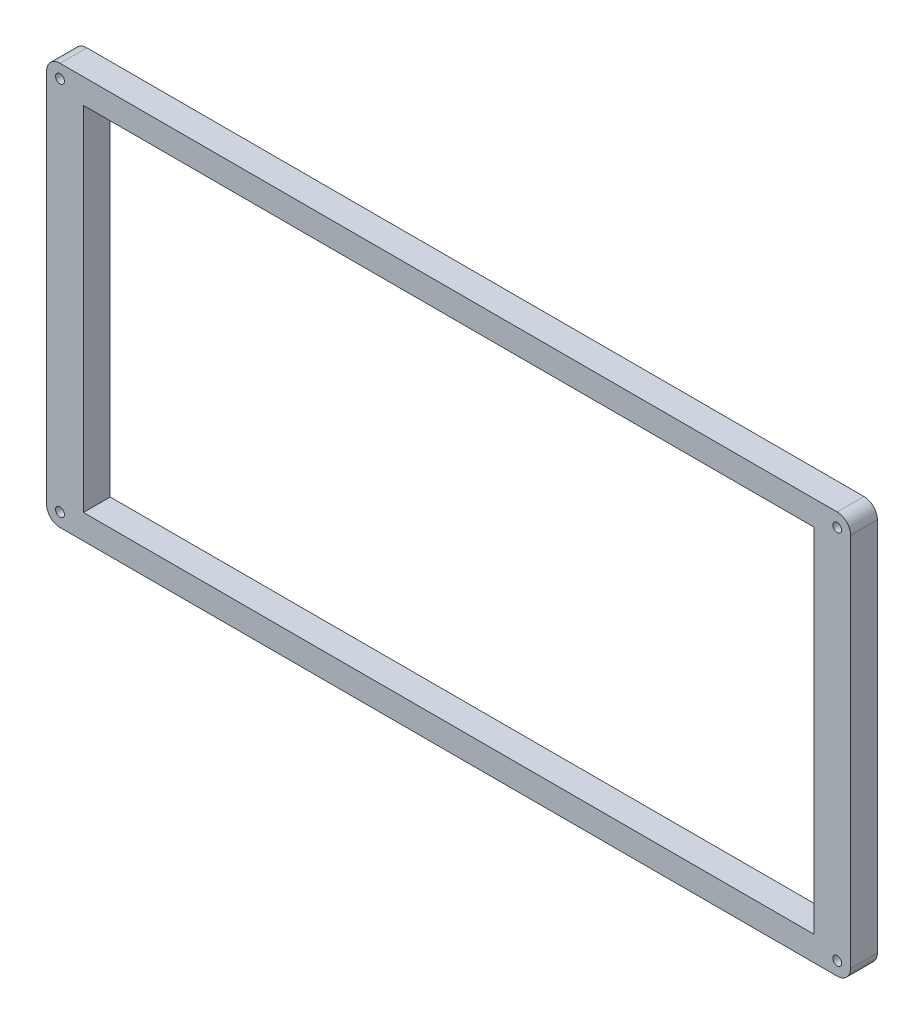
ISO-10303-21;
HEADER;
FILE_DESCRIPTION(('STEP AP214'),'2;1');
FILE_NAME('part.step','',(''),(''),'','','');
FILE_SCHEMA(('AUTOMOTIVE_DESIGN { 1 0 10303 214 1 1 1 1 }'));
ENDSEC;
DATA;
#1=APPLICATION_CONTEXT('core data for automotive mechanical design processes');
#2=APPLICATION_PROTOCOL_DEFINITION('international standard','automotive_design',2000,#1);
#3=PRODUCT_CONTEXT('',#1,'mechanical');
#4=PRODUCT('Part','Part','',(#3));
#5=PRODUCT_RELATED_PRODUCT_CATEGORY('part','',(#4));
#6=PRODUCT_DEFINITION_FORMATION('','',#4);
#7=PRODUCT_DEFINITION_CONTEXT('part definition',#1,'design');
#8=PRODUCT_DEFINITION('design','',#6,#7);
#9=PRODUCT_DEFINITION_SHAPE('','',#8);
#10=(LENGTH_UNIT() NAMED_UNIT(*) SI_UNIT(.MILLI.,.METRE.));
#11=(NAMED_UNIT(*) PLANE_ANGLE_UNIT() SI_UNIT($,.RADIAN.));
#12=(NAMED_UNIT(*) SI_UNIT($,.STERADIAN.) SOLID_ANGLE_UNIT());
#13=UNCERTAINTY_MEASURE_WITH_UNIT(LENGTH_MEASURE(1.E-05),#10,'distance_accuracy_value','');
#14=(GEOMETRIC_REPRESENTATION_CONTEXT(3) GLOBAL_UNCERTAINTY_ASSIGNED_CONTEXT((#13)) GLOBAL_UNIT_ASSIGNED_CONTEXT((#10,
#11,#12)) REPRESENTATION_CONTEXT('',''));
#15=CARTESIAN_POINT('',(0.,0.,0.));
#16=DIRECTION('',(0.,0.,1.));
#17=DIRECTION('',(1.,0.,0.));
#18=AXIS2_PLACEMENT_3D('',#15,#16,#17);
#19=CARTESIAN_POINT('',(212.844809866393,104.874140248241,10.));
#20=DIRECTION('',(0.,0.,-1.));
#21=DIRECTION('',(-1.,0.,0.));
#22=AXIS2_PLACEMENT_3D('',#19,#20,#21);
#23=PLANE('',#22);
#24=CARTESIAN_POINT('',(212.844809866393,104.874140248241,10.));
#25=DIRECTION('',(0.,0.,1.));
#26=DIRECTION('',(1.,0.,0.));
#27=AXIS2_PLACEMENT_3D('',#24,#25,#26);
#28=CIRCLE('',#27,1.65000000000002);
#29=CARTESIAN_POINT('',(214.494809866393,104.874140248241,10.));
#30=VERTEX_POINT('',#29);
#31=EDGE_CURVE('E160',#30,#30,#28,.T.);
#32=ORIENTED_EDGE('',*,*,#31,.F.);
#33=EDGE_LOOP('',(#32));
#34=FACE_BOUND('',#33,.T.);
#35=CARTESIAN_POINT('',(212.844809866393,-35.125859751759,10.));
#36=DIRECTION('',(0.,0.,1.));
#37=DIRECTION('',(1.,0.,0.));
#38=AXIS2_PLACEMENT_3D('',#35,#36,#37);
#39=CIRCLE('',#38,1.65000000000002);
#40=CARTESIAN_POINT('',(214.494809866393,-35.125859751759,10.));
#41=VERTEX_POINT('',#40);
#42=EDGE_CURVE('E166',#41,#41,#39,.T.);
#43=ORIENTED_EDGE('',*,*,#42,.F.);
#44=EDGE_LOOP('',(#43));
#45=FACE_BOUND('',#44,.T.);
#46=CARTESIAN_POINT('',(-77.1551901336074,-35.125859751759,10.));
#47=DIRECTION('',(0.,0.,1.));
#48=DIRECTION('',(1.,0.,0.));
#49=AXIS2_PLACEMENT_3D('',#46,#47,#48);
#50=CIRCLE('',#49,1.65);
#51=CARTESIAN_POINT('',(-75.5051901336074,-35.125859751759,10.));
#52=VERTEX_POINT('',#51);
#53=EDGE_CURVE('E172',#52,#52,#50,.T.);
#54=ORIENTED_EDGE('',*,*,#53,.F.);
#55=EDGE_LOOP('',(#54));
#56=FACE_BOUND('',#55,.T.);
#57=CARTESIAN_POINT('',(-77.1551901336074,104.874140248241,10.));
#58=DIRECTION('',(0.,0.,1.));
#59=DIRECTION('',(1.,0.,0.));
#60=AXIS2_PLACEMENT_3D('',#57,#58,#59);
#61=CIRCLE('',#60,1.65);
#62=CARTESIAN_POINT('',(-75.5051901336074,104.874140248241,10.));
#63=VERTEX_POINT('',#62);
#64=EDGE_CURVE('E178',#63,#63,#61,.T.);
#65=ORIENTED_EDGE('',*,*,#64,.F.);
#66=EDGE_LOOP('',(#65));
#67=FACE_BOUND('',#66,.T.);
#68=CARTESIAN_POINT('',(212.844809866393,104.874140248241,10.));
#69=DIRECTION('',(0.,0.,1.));
#70=DIRECTION('',(-1.,0.,0.));
#71=AXIS2_PLACEMENT_3D('',#68,#69,#70);
#72=CIRCLE('',#71,5.00000000000002);
#73=CARTESIAN_POINT('',(217.844809866393,104.874140248241,10.));
#74=VERTEX_POINT('',#73);
#75=CARTESIAN_POINT('',(212.844809866392,109.874140248241,10.));
#76=VERTEX_POINT('',#75);
#77=EDGE_CURVE('E184',#74,#76,#72,.T.);
#78=ORIENTED_EDGE('',*,*,#77,.T.);
#79=DIRECTION('',(-1.,0.,0.));
#80=VECTOR('',#79,1.);
#81=CARTESIAN_POINT('',(-77.1551901336074,109.874140248241,10.));
#82=LINE('',#81,#80);
#83=CARTESIAN_POINT('',(-77.1551901336074,109.874140248241,10.));
#84=VERTEX_POINT('',#83);
#85=EDGE_CURVE('E187',#76,#84,#82,.T.);
#86=ORIENTED_EDGE('',*,*,#85,.T.);
#87=CARTESIAN_POINT('',(-77.1551901336074,104.874140248241,10.));
#88=DIRECTION('',(0.,0.,1.));
#89=DIRECTION('',(1.,0.,0.));
#90=AXIS2_PLACEMENT_3D('',#87,#88,#89);
#91=CIRCLE('',#90,5.);
#92=CARTESIAN_POINT('',(-82.1551901336074,104.874140248241,10.));
#93=VERTEX_POINT('',#92);
#94=EDGE_CURVE('E190',#84,#93,#91,.T.);
#95=ORIENTED_EDGE('',*,*,#94,.T.);
#96=DIRECTION('',(0.,-1.,0.));
#97=VECTOR('',#96,1.);
#98=CARTESIAN_POINT('',(-82.1551901336074,104.874140248241,10.));
#99=LINE('',#98,#97);
#100=CARTESIAN_POINT('',(-82.1551901336074,-35.125859751759,10.));
#101=VERTEX_POINT('',#100);
#102=EDGE_CURVE('E192',#93,#101,#99,.T.);
#103=ORIENTED_EDGE('',*,*,#102,.T.);
#104=CARTESIAN_POINT('',(-77.1551901336074,-35.125859751759,10.));
#105=DIRECTION('',(0.,0.,1.));
#106=DIRECTION('',(1.,0.,0.));
#107=AXIS2_PLACEMENT_3D('',#104,#105,#106);
#108=CIRCLE('',#107,5.);
#109=CARTESIAN_POINT('',(-77.1551901336074,-40.125859751759,10.));
#110=VERTEX_POINT('',#109);
#111=EDGE_CURVE('E194',#101,#110,#108,.T.);
#112=ORIENTED_EDGE('',*,*,#111,.T.);
#113=DIRECTION('',(1.,0.,0.));
#114=VECTOR('',#113,1.);
#115=CARTESIAN_POINT('',(-77.1551901336074,-40.125859751759,10.));
#116=LINE('',#115,#114);
#117=CARTESIAN_POINT('',(212.844809866393,-40.125859751759,10.));
#118=VERTEX_POINT('',#117);
#119=EDGE_CURVE('E196',#110,#118,#116,.T.);
#120=ORIENTED_EDGE('',*,*,#119,.T.);
#121=CARTESIAN_POINT('',(212.844809866393,-35.125859751759,10.));
#122=DIRECTION('',(0.,0.,1.));
#123=DIRECTION('',(1.,0.,0.));
#124=AXIS2_PLACEMENT_3D('',#121,#122,#123);
#125=CIRCLE('',#124,5.);
#126=CARTESIAN_POINT('',(217.844809866393,-35.125859751759,10.));
#127=VERTEX_POINT('',#126);
#128=EDGE_CURVE('E198',#118,#127,#125,.T.);
#129=ORIENTED_EDGE('',*,*,#128,.T.);
#130=DIRECTION('',(0.,1.,0.));
#131=VECTOR('',#130,1.);
#132=CARTESIAN_POINT('',(217.844809866393,104.874140248241,10.));
#133=LINE('',#132,#131);
#134=EDGE_CURVE('E200',#127,#74,#133,.T.);
#135=ORIENTED_EDGE('',*,*,#134,.T.);
#136=EDGE_LOOP('',(#78,#86,#95,#103,#112,#120,#129,#135));
#137=FACE_BOUND('',#136,.T.);
#138=DIRECTION('',(0.,1.,0.));
#139=VECTOR('',#138,1.);
#140=CARTESIAN_POINT('',(204.106703020252,-30.9074633432772,10.));
#141=LINE('',#140,#139);
#142=CARTESIAN_POINT('',(204.106703020252,-30.9074633432772,10.));
#143=VERTEX_POINT('',#142);
#144=CARTESIAN_POINT('',(204.106703020252,100.655743839759,10.));
#145=VERTEX_POINT('',#144);
#146=EDGE_CURVE('E124',#143,#145,#141,.T.);
#147=ORIENTED_EDGE('',*,*,#146,.F.);
#148=DIRECTION('',(1.,0.,0.));
#149=VECTOR('',#148,1.);
#150=CARTESIAN_POINT('',(-68.4170832874667,-30.9074633432772,10.));
#151=LINE('',#150,#149);
#152=CARTESIAN_POINT('',(-68.4170832874667,-30.9074633432772,10.));
#153=VERTEX_POINT('',#152);
#154=EDGE_CURVE('E146',#153,#143,#151,.T.);
#155=ORIENTED_EDGE('',*,*,#154,.F.);
#156=DIRECTION('',(0.,-1.,0.));
#157=VECTOR('',#156,1.);
#158=CARTESIAN_POINT('',(-68.4170832874667,-30.9074633432772,10.));
#159=LINE('',#158,#157);
#160=CARTESIAN_POINT('',(-68.4170832874667,100.655743839759,10.));
#161=VERTEX_POINT('',#160);
#162=EDGE_CURVE('E144',#161,#153,#159,.T.);
#163=ORIENTED_EDGE('',*,*,#162,.F.);
#164=DIRECTION('',(-1.,0.,0.));
#165=VECTOR('',#164,1.);
#166=CARTESIAN_POINT('',(-68.4170832874667,100.655743839759,10.));
#167=LINE('',#166,#165);
#168=EDGE_CURVE('E132',#145,#161,#167,.T.);
#169=ORIENTED_EDGE('',*,*,#168,.F.);
#170=EDGE_LOOP('',(#147,#155,#163,#169));
#171=FACE_BOUND('',#170,.T.);
#172=ADVANCED_FACE('F35',(#34,#45,#56,#67,#137,#171),#23,.F.);
#173=CARTESIAN_POINT('',(212.844809866393,104.874140248241,0.));
#174=DIRECTION('',(0.,0.,-1.));
#175=DIRECTION('',(-1.,0.,0.));
#176=AXIS2_PLACEMENT_3D('',#173,#174,#175);
#177=PLANE('',#176);
#178=CARTESIAN_POINT('',(212.844809866393,-35.125859751759,0.));
#179=DIRECTION('',(0.,0.,1.));
#180=DIRECTION('',(1.,0.,0.));
#181=AXIS2_PLACEMENT_3D('',#178,#179,#180);
#182=CIRCLE('',#181,1.65000000000002);
#183=CARTESIAN_POINT('',(214.494809866393,-35.125859751759,0.));
#184=VERTEX_POINT('',#183);
#185=EDGE_CURVE('E163',#184,#184,#182,.T.);
#186=ORIENTED_EDGE('',*,*,#185,.T.);
#187=EDGE_LOOP('',(#186));
#188=FACE_BOUND('',#187,.T.);
#189=CARTESIAN_POINT('',(-77.1551901336074,104.874140248241,0.));
#190=DIRECTION('',(0.,0.,1.));
#191=DIRECTION('',(1.,0.,0.));
#192=AXIS2_PLACEMENT_3D('',#189,#190,#191);
#193=CIRCLE('',#192,1.65);
#194=CARTESIAN_POINT('',(-75.5051901336074,104.874140248241,0.));
#195=VERTEX_POINT('',#194);
#196=EDGE_CURVE('E175',#195,#195,#193,.T.);
#197=ORIENTED_EDGE('',*,*,#196,.T.);
#198=EDGE_LOOP('',(#197));
#199=FACE_BOUND('',#198,.T.);
#200=CARTESIAN_POINT('',(212.844809866393,104.874140248241,0.));
#201=DIRECTION('',(0.,0.,1.));
#202=DIRECTION('',(-1.,0.,0.));
#203=AXIS2_PLACEMENT_3D('',#200,#201,#202);
#204=CIRCLE('',#203,5.00000000000002);
#205=CARTESIAN_POINT('',(217.844809866393,104.874140248241,0.));
#206=VERTEX_POINT('',#205);
#207=CARTESIAN_POINT('',(212.844809866392,109.874140248241,0.));
#208=VERTEX_POINT('',#207);
#209=EDGE_CURVE('E181',#206,#208,#204,.T.);
#210=ORIENTED_EDGE('',*,*,#209,.F.);
#211=DIRECTION('',(0.,1.,0.));
#212=VECTOR('',#211,1.);
#213=CARTESIAN_POINT('',(217.844809866393,104.874140248241,0.));
#214=LINE('',#213,#212);
#215=CARTESIAN_POINT('',(217.844809866393,-35.125859751759,0.));
#216=VERTEX_POINT('',#215);
#217=EDGE_CURVE('E188',#216,#206,#214,.T.);
#218=ORIENTED_EDGE('',*,*,#217,.F.);
#219=CARTESIAN_POINT('',(212.844809866393,-35.125859751759,0.));
#220=DIRECTION('',(0.,0.,1.));
#221=DIRECTION('',(1.,0.,0.));
#222=AXIS2_PLACEMENT_3D('',#219,#220,#221);
#223=CIRCLE('',#222,5.);
#224=CARTESIAN_POINT('',(212.844809866393,-40.125859751759,0.));
#225=VERTEX_POINT('',#224);
#226=EDGE_CURVE('E215',#225,#216,#223,.T.);
#227=ORIENTED_EDGE('',*,*,#226,.F.);
#228=DIRECTION('',(1.,0.,0.));
#229=VECTOR('',#228,1.);
#230=CARTESIAN_POINT('',(-77.1551901336074,-40.125859751759,0.));
#231=LINE('',#230,#229);
#232=CARTESIAN_POINT('',(-77.1551901336074,-40.125859751759,0.));
#233=VERTEX_POINT('',#232);
#234=EDGE_CURVE('E213',#233,#225,#231,.T.);
#235=ORIENTED_EDGE('',*,*,#234,.F.);
#236=CARTESIAN_POINT('',(-77.1551901336074,-35.125859751759,0.));
#237=DIRECTION('',(0.,0.,1.));
#238=DIRECTION('',(1.,0.,0.));
#239=AXIS2_PLACEMENT_3D('',#236,#237,#238);
#240=CIRCLE('',#239,5.);
#241=CARTESIAN_POINT('',(-82.1551901336074,-35.125859751759,0.));
#242=VERTEX_POINT('',#241);
#243=EDGE_CURVE('E211',#242,#233,#240,.T.);
#244=ORIENTED_EDGE('',*,*,#243,.F.);
#245=DIRECTION('',(0.,-1.,0.));
#246=VECTOR('',#245,1.);
#247=CARTESIAN_POINT('',(-82.1551901336074,104.874140248241,0.));
#248=LINE('',#247,#246);
#249=CARTESIAN_POINT('',(-82.1551901336074,104.874140248241,0.));
#250=VERTEX_POINT('',#249);
#251=EDGE_CURVE('E209',#250,#242,#248,.T.);
#252=ORIENTED_EDGE('',*,*,#251,.F.);
#253=CARTESIAN_POINT('',(-77.1551901336074,104.874140248241,0.));
#254=DIRECTION('',(0.,0.,1.));
#255=DIRECTION('',(1.,0.,0.));
#256=AXIS2_PLACEMENT_3D('',#253,#254,#255);
#257=CIRCLE('',#256,5.);
#258=CARTESIAN_POINT('',(-77.1551901336074,109.874140248241,0.));
#259=VERTEX_POINT('',#258);
#260=EDGE_CURVE('E207',#259,#250,#257,.T.);
#261=ORIENTED_EDGE('',*,*,#260,.F.);
#262=DIRECTION('',(-1.,0.,0.));
#263=VECTOR('',#262,1.);
#264=CARTESIAN_POINT('',(-77.1551901336074,109.874140248241,0.));
#265=LINE('',#264,#263);
#266=EDGE_CURVE('E205',#208,#259,#265,.T.);
#267=ORIENTED_EDGE('',*,*,#266,.F.);
#268=EDGE_LOOP('',(#210,#218,#227,#235,#244,#252,#261,#267));
#269=FACE_BOUND('',#268,.T.);
#270=CARTESIAN_POINT('',(-77.1551901336074,-35.125859751759,0.));
#271=DIRECTION('',(0.,0.,1.));
#272=DIRECTION('',(1.,0.,0.));
#273=AXIS2_PLACEMENT_3D('',#270,#271,#272);
#274=CIRCLE('',#273,1.65);
#275=CARTESIAN_POINT('',(-75.5051901336074,-35.125859751759,0.));
#276=VERTEX_POINT('',#275);
#277=EDGE_CURVE('E169',#276,#276,#274,.T.);
#278=ORIENTED_EDGE('',*,*,#277,.T.);
#279=EDGE_LOOP('',(#278));
#280=FACE_BOUND('',#279,.T.);
#281=CARTESIAN_POINT('',(212.844809866393,104.874140248241,0.));
#282=DIRECTION('',(0.,0.,1.));
#283=DIRECTION('',(1.,0.,0.));
#284=AXIS2_PLACEMENT_3D('',#281,#282,#283);
#285=CIRCLE('',#284,1.65000000000002);
#286=CARTESIAN_POINT('',(214.494809866393,104.874140248241,0.));
#287=VERTEX_POINT('',#286);
#288=EDGE_CURVE('E140',#287,#287,#285,.T.);
#289=ORIENTED_EDGE('',*,*,#288,.T.);
#290=EDGE_LOOP('',(#289));
#291=FACE_BOUND('',#290,.T.);
#292=DIRECTION('',(1.,0.,0.));
#293=VECTOR('',#292,1.);
#294=CARTESIAN_POINT('',(-68.4170832874667,-30.9074633432772,0.));
#295=LINE('',#294,#293);
#296=CARTESIAN_POINT('',(-68.4170832874667,-30.9074633432772,0.));
#297=VERTEX_POINT('',#296);
#298=CARTESIAN_POINT('',(204.106703020252,-30.9074633432772,0.));
#299=VERTEX_POINT('',#298);
#300=EDGE_CURVE('E133',#297,#299,#295,.T.);
#301=ORIENTED_EDGE('',*,*,#300,.T.);
#302=DIRECTION('',(0.,1.,0.));
#303=VECTOR('',#302,1.);
#304=CARTESIAN_POINT('',(204.106703020252,-30.9074633432772,0.));
#305=LINE('',#304,#303);
#306=CARTESIAN_POINT('',(204.106703020252,100.655743839759,0.));
#307=VERTEX_POINT('',#306);
#308=EDGE_CURVE('E58',#299,#307,#305,.T.);
#309=ORIENTED_EDGE('',*,*,#308,.T.);
#310=DIRECTION('',(-1.,0.,0.));
#311=VECTOR('',#310,1.);
#312=CARTESIAN_POINT('',(-68.4170832874667,100.655743839759,0.));
#313=LINE('',#312,#311);
#314=CARTESIAN_POINT('',(-68.4170832874667,100.655743839759,0.));
#315=VERTEX_POINT('',#314);
#316=EDGE_CURVE('E139',#307,#315,#313,.T.);
#317=ORIENTED_EDGE('',*,*,#316,.T.);
#318=DIRECTION('',(0.,-1.,0.));
#319=VECTOR('',#318,1.);
#320=CARTESIAN_POINT('',(-68.4170832874667,-30.9074633432772,0.));
#321=LINE('',#320,#319);
#322=EDGE_CURVE('E152',#315,#297,#321,.T.);
#323=ORIENTED_EDGE('',*,*,#322,.T.);
#324=EDGE_LOOP('',(#301,#309,#317,#323));
#325=FACE_BOUND('',#324,.T.);
#326=ADVANCED_FACE('F245',(#188,#199,#269,#280,#291,#325),#177,.T.);
#327=CARTESIAN_POINT('',(212.844809866393,104.874140248241,10.));
#328=DIRECTION('',(0.,0.,-1.));
#329=DIRECTION('',(-1.,0.,0.));
#330=AXIS2_PLACEMENT_3D('',#327,#328,#329);
#331=CYLINDRICAL_SURFACE('',#330,5.00000000000002);
#332=ORIENTED_EDGE('',*,*,#209,.T.);
#333=DIRECTION('',(0.,0.,-1.));
#334=VECTOR('',#333,1.);
#335=CARTESIAN_POINT('',(212.844809866392,109.874140248241,10.));
#336=LINE('',#335,#334);
#337=EDGE_CURVE('E11',#76,#208,#336,.T.);
#338=ORIENTED_EDGE('',*,*,#337,.F.);
#339=ORIENTED_EDGE('',*,*,#77,.F.);
#340=DIRECTION('',(0.,0.,-1.));
#341=VECTOR('',#340,1.);
#342=CARTESIAN_POINT('',(217.844809866393,104.874140248241,10.));
#343=LINE('',#342,#341);
#344=EDGE_CURVE('E202',#74,#206,#343,.T.);
#345=ORIENTED_EDGE('',*,*,#344,.T.);
#346=EDGE_LOOP('',(#332,#338,#339,#345));
#347=FACE_BOUND('',#346,.T.);
#348=ADVANCED_FACE('F37',(#347),#331,.T.);
#349=CARTESIAN_POINT('',(-77.1551901336074,109.874140248241,10.));
#350=DIRECTION('',(0.,-1.,0.));
#351=DIRECTION('',(1.,0.,0.));
#352=AXIS2_PLACEMENT_3D('',#349,#350,#351);
#353=PLANE('',#352);
#354=ORIENTED_EDGE('',*,*,#266,.T.);
#355=DIRECTION('',(0.,0.,-1.));
#356=VECTOR('',#355,1.);
#357=CARTESIAN_POINT('',(-77.1551901336074,109.874140248241,10.));
#358=LINE('',#357,#356);
#359=EDGE_CURVE('E43',#84,#259,#358,.T.);
#360=ORIENTED_EDGE('',*,*,#359,.F.);
#361=ORIENTED_EDGE('',*,*,#85,.F.);
#362=ORIENTED_EDGE('',*,*,#337,.T.);
#363=EDGE_LOOP('',(#354,#360,#361,#362));
#364=FACE_BOUND('',#363,.T.);
#365=ADVANCED_FACE('F262',(#364),#353,.F.);
#366=CARTESIAN_POINT('',(-77.1551901336074,104.874140248241,10.));
#367=DIRECTION('',(0.,0.,-1.));
#368=DIRECTION('',(-1.,0.,0.));
#369=AXIS2_PLACEMENT_3D('',#366,#367,#368);
#370=CYLINDRICAL_SURFACE('',#369,5.);
#371=ORIENTED_EDGE('',*,*,#260,.T.);
#372=DIRECTION('',(0.,0.,-1.));
#373=VECTOR('',#372,1.);
#374=CARTESIAN_POINT('',(-82.1551901336074,104.874140248241,10.));
#375=LINE('',#374,#373);
#376=EDGE_CURVE('E232',#93,#250,#375,.T.);
#377=ORIENTED_EDGE('',*,*,#376,.F.);
#378=ORIENTED_EDGE('',*,*,#94,.F.);
#379=ORIENTED_EDGE('',*,*,#359,.T.);
#380=EDGE_LOOP('',(#371,#377,#378,#379));
#381=FACE_BOUND('',#380,.T.);
#382=ADVANCED_FACE('F239',(#381),#370,.T.);
#383=CARTESIAN_POINT('',(-82.1551901336074,104.874140248241,10.));
#384=DIRECTION('',(1.,0.,0.));
#385=DIRECTION('',(0.,1.,0.));
#386=AXIS2_PLACEMENT_3D('',#383,#384,#385);
#387=PLANE('',#386);
#388=ORIENTED_EDGE('',*,*,#251,.T.);
#389=DIRECTION('',(0.,0.,-1.));
#390=VECTOR('',#389,1.);
#391=CARTESIAN_POINT('',(-82.1551901336074,-35.125859751759,10.));
#392=LINE('',#391,#390);
#393=EDGE_CURVE('E229',#101,#242,#392,.T.);
#394=ORIENTED_EDGE('',*,*,#393,.F.);
#395=ORIENTED_EDGE('',*,*,#102,.F.);
#396=ORIENTED_EDGE('',*,*,#376,.T.);
#397=EDGE_LOOP('',(#388,#394,#395,#396));
#398=FACE_BOUND('',#397,.T.);
#399=ADVANCED_FACE('F251',(#398),#387,.F.);
#400=CARTESIAN_POINT('',(-77.1551901336074,-35.125859751759,10.));
#401=DIRECTION('',(0.,0.,-1.));
#402=DIRECTION('',(-1.,0.,0.));
#403=AXIS2_PLACEMENT_3D('',#400,#401,#402);
#404=CYLINDRICAL_SURFACE('',#403,5.);
#405=ORIENTED_EDGE('',*,*,#243,.T.);
#406=DIRECTION('',(0.,0.,-1.));
#407=VECTOR('',#406,1.);
#408=CARTESIAN_POINT('',(-77.1551901336074,-40.125859751759,10.));
#409=LINE('',#408,#407);
#410=EDGE_CURVE('E226',#110,#233,#409,.T.);
#411=ORIENTED_EDGE('',*,*,#410,.F.);
#412=ORIENTED_EDGE('',*,*,#111,.F.);
#413=ORIENTED_EDGE('',*,*,#393,.T.);
#414=EDGE_LOOP('',(#405,#411,#412,#413));
#415=FACE_BOUND('',#414,.T.);
#416=ADVANCED_FACE('F255',(#415),#404,.T.);
#417=CARTESIAN_POINT('',(-77.1551901336074,-40.125859751759,10.));
#418=DIRECTION('',(0.,1.,0.));
#419=DIRECTION('',(0.,0.,1.));
#420=AXIS2_PLACEMENT_3D('',#417,#418,#419);
#421=PLANE('',#420);
#422=ORIENTED_EDGE('',*,*,#234,.T.);
#423=DIRECTION('',(0.,0.,-1.));
#424=VECTOR('',#423,1.);
#425=CARTESIAN_POINT('',(212.844809866393,-40.125859751759,10.));
#426=LINE('',#425,#424);
#427=EDGE_CURVE('E223',#118,#225,#426,.T.);
#428=ORIENTED_EDGE('',*,*,#427,.F.);
#429=ORIENTED_EDGE('',*,*,#119,.F.);
#430=ORIENTED_EDGE('',*,*,#410,.T.);
#431=EDGE_LOOP('',(#422,#428,#429,#430));
#432=FACE_BOUND('',#431,.T.);
#433=ADVANCED_FACE('F275',(#432),#421,.F.);
#434=CARTESIAN_POINT('',(212.844809866393,-35.125859751759,10.));
#435=DIRECTION('',(0.,0.,-1.));
#436=DIRECTION('',(-1.,0.,0.));
#437=AXIS2_PLACEMENT_3D('',#434,#435,#436);
#438=CYLINDRICAL_SURFACE('',#437,5.);
#439=ORIENTED_EDGE('',*,*,#226,.T.);
#440=DIRECTION('',(0.,0.,-1.));
#441=VECTOR('',#440,1.);
#442=CARTESIAN_POINT('',(217.844809866393,-35.125859751759,10.));
#443=LINE('',#442,#441);
#444=EDGE_CURVE('E220',#127,#216,#443,.T.);
#445=ORIENTED_EDGE('',*,*,#444,.F.);
#446=ORIENTED_EDGE('',*,*,#128,.F.);
#447=ORIENTED_EDGE('',*,*,#427,.T.);
#448=EDGE_LOOP('',(#439,#445,#446,#447));
#449=FACE_BOUND('',#448,.T.);
#450=ADVANCED_FACE('F273',(#449),#438,.T.);
#451=CARTESIAN_POINT('',(217.844809866393,104.874140248241,10.));
#452=DIRECTION('',(-1.,0.,0.));
#453=DIRECTION('',(0.,-1.,0.));
#454=AXIS2_PLACEMENT_3D('',#451,#452,#453);
#455=PLANE('',#454);
#456=ORIENTED_EDGE('',*,*,#217,.T.);
#457=ORIENTED_EDGE('',*,*,#344,.F.);
#458=ORIENTED_EDGE('',*,*,#134,.F.);
#459=ORIENTED_EDGE('',*,*,#444,.T.);
#460=EDGE_LOOP('',(#456,#457,#458,#459));
#461=FACE_BOUND('',#460,.T.);
#462=ADVANCED_FACE('F268',(#461),#455,.F.);
#463=CARTESIAN_POINT('',(-77.1551901336074,104.874140248241,10.));
#464=DIRECTION('',(0.,0.,-1.));
#465=DIRECTION('',(-1.,0.,0.));
#466=AXIS2_PLACEMENT_3D('',#463,#464,#465);
#467=CYLINDRICAL_SURFACE('',#466,1.65);
#468=ORIENTED_EDGE('',*,*,#64,.T.);
#469=EDGE_LOOP('',(#468));
#470=FACE_BOUND('',#469,.T.);
#471=ORIENTED_EDGE('',*,*,#196,.F.);
#472=EDGE_LOOP('',(#471));
#473=FACE_BOUND('',#472,.T.);
#474=ADVANCED_FACE('F295',(#470,#473),#467,.F.);
#475=CARTESIAN_POINT('',(-77.1551901336074,-35.125859751759,10.));
#476=DIRECTION('',(0.,0.,-1.));
#477=DIRECTION('',(-1.,0.,0.));
#478=AXIS2_PLACEMENT_3D('',#475,#476,#477);
#479=CYLINDRICAL_SURFACE('',#478,1.65);
#480=ORIENTED_EDGE('',*,*,#53,.T.);
#481=EDGE_LOOP('',(#480));
#482=FACE_BOUND('',#481,.T.);
#483=ORIENTED_EDGE('',*,*,#277,.F.);
#484=EDGE_LOOP('',(#483));
#485=FACE_BOUND('',#484,.T.);
#486=ADVANCED_FACE('F302',(#482,#485),#479,.F.);
#487=CARTESIAN_POINT('',(212.844809866393,-35.125859751759,10.));
#488=DIRECTION('',(0.,0.,-1.));
#489=DIRECTION('',(-1.,0.,0.));
#490=AXIS2_PLACEMENT_3D('',#487,#488,#489);
#491=CYLINDRICAL_SURFACE('',#490,1.65000000000002);
#492=ORIENTED_EDGE('',*,*,#42,.T.);
#493=EDGE_LOOP('',(#492));
#494=FACE_BOUND('',#493,.T.);
#495=ORIENTED_EDGE('',*,*,#185,.F.);
#496=EDGE_LOOP('',(#495));
#497=FACE_BOUND('',#496,.T.);
#498=ADVANCED_FACE('F307',(#494,#497),#491,.F.);
#499=CARTESIAN_POINT('',(212.844809866393,104.874140248241,10.));
#500=DIRECTION('',(0.,0.,-1.));
#501=DIRECTION('',(-1.,0.,0.));
#502=AXIS2_PLACEMENT_3D('',#499,#500,#501);
#503=CYLINDRICAL_SURFACE('',#502,1.65000000000002);
#504=ORIENTED_EDGE('',*,*,#31,.T.);
#505=EDGE_LOOP('',(#504));
#506=FACE_BOUND('',#505,.T.);
#507=ORIENTED_EDGE('',*,*,#288,.F.);
#508=EDGE_LOOP('',(#507));
#509=FACE_BOUND('',#508,.T.);
#510=ADVANCED_FACE('F317',(#506,#509),#503,.F.);
#511=CARTESIAN_POINT('',(204.106703020252,-30.9074633432772,10.));
#512=DIRECTION('',(-1.,0.,0.));
#513=DIRECTION('',(0.,0.,1.));
#514=AXIS2_PLACEMENT_3D('',#511,#512,#513);
#515=PLANE('',#514);
#516=ORIENTED_EDGE('',*,*,#308,.F.);
#517=DIRECTION('',(0.,0.,-1.));
#518=VECTOR('',#517,1.);
#519=CARTESIAN_POINT('',(204.106703020252,-30.9074633432772,10.));
#520=LINE('',#519,#518);
#521=EDGE_CURVE('E128',#143,#299,#520,.T.);
#522=ORIENTED_EDGE('',*,*,#521,.F.);
#523=ORIENTED_EDGE('',*,*,#146,.T.);
#524=DIRECTION('',(0.,0.,-1.));
#525=VECTOR('',#524,1.);
#526=CARTESIAN_POINT('',(204.106703020252,100.655743839759,10.));
#527=LINE('',#526,#525);
#528=EDGE_CURVE('E127',#145,#307,#527,.T.);
#529=ORIENTED_EDGE('',*,*,#528,.T.);
#530=EDGE_LOOP('',(#516,#522,#523,#529));
#531=FACE_BOUND('',#530,.T.);
#532=ADVANCED_FACE('F126',(#531),#515,.T.);
#533=CARTESIAN_POINT('',(-68.4170832874667,100.655743839759,10.));
#534=DIRECTION('',(0.,-1.,0.));
#535=DIRECTION('',(0.,0.,-1.));
#536=AXIS2_PLACEMENT_3D('',#533,#534,#535);
#537=PLANE('',#536);
#538=ORIENTED_EDGE('',*,*,#316,.F.);
#539=ORIENTED_EDGE('',*,*,#528,.F.);
#540=ORIENTED_EDGE('',*,*,#168,.T.);
#541=DIRECTION('',(0.,0.,-1.));
#542=VECTOR('',#541,1.);
#543=CARTESIAN_POINT('',(-68.4170832874667,100.655743839759,10.));
#544=LINE('',#543,#542);
#545=EDGE_CURVE('E141',#161,#315,#544,.T.);
#546=ORIENTED_EDGE('',*,*,#545,.T.);
#547=EDGE_LOOP('',(#538,#539,#540,#546));
#548=FACE_BOUND('',#547,.T.);
#549=ADVANCED_FACE('F136',(#548),#537,.T.);
#550=CARTESIAN_POINT('',(-68.4170832874667,-30.9074633432772,10.));
#551=DIRECTION('',(1.,0.,0.));
#552=DIRECTION('',(0.,0.,-1.));
#553=AXIS2_PLACEMENT_3D('',#550,#551,#552);
#554=PLANE('',#553);
#555=ORIENTED_EDGE('',*,*,#322,.F.);
#556=ORIENTED_EDGE('',*,*,#545,.F.);
#557=ORIENTED_EDGE('',*,*,#162,.T.);
#558=DIRECTION('',(0.,0.,-1.));
#559=VECTOR('',#558,1.);
#560=CARTESIAN_POINT('',(-68.4170832874667,-30.9074633432772,10.));
#561=LINE('',#560,#559);
#562=EDGE_CURVE('E50',#153,#297,#561,.T.);
#563=ORIENTED_EDGE('',*,*,#562,.T.);
#564=EDGE_LOOP('',(#555,#556,#557,#563));
#565=FACE_BOUND('',#564,.T.);
#566=ADVANCED_FACE('F329',(#565),#554,.T.);
#567=CARTESIAN_POINT('',(-68.4170832874667,-30.9074633432772,10.));
#568=DIRECTION('',(0.,1.,0.));
#569=DIRECTION('',(0.,0.,1.));
#570=AXIS2_PLACEMENT_3D('',#567,#568,#569);
#571=PLANE('',#570);
#572=ORIENTED_EDGE('',*,*,#300,.F.);
#573=ORIENTED_EDGE('',*,*,#562,.F.);
#574=ORIENTED_EDGE('',*,*,#154,.T.);
#575=ORIENTED_EDGE('',*,*,#521,.T.);
#576=EDGE_LOOP('',(#572,#573,#574,#575));
#577=FACE_BOUND('',#576,.T.);
#578=ADVANCED_FACE('F332',(#577),#571,.T.);
#579=CLOSED_SHELL('',(#172,#326,#348,#365,#382,#399,#416,#433,#450,#462,#474,#486,#498,#510,
#532,#549,#566,#578));
#580=MANIFOLD_SOLID_BREP('B2',#579);
#581=ADVANCED_BREP_SHAPE_REPRESENTATION('',(#18,#580),#14);
#582=SHAPE_DEFINITION_REPRESENTATION(#9,#581);
ENDSEC;
END-ISO-10303-21;
